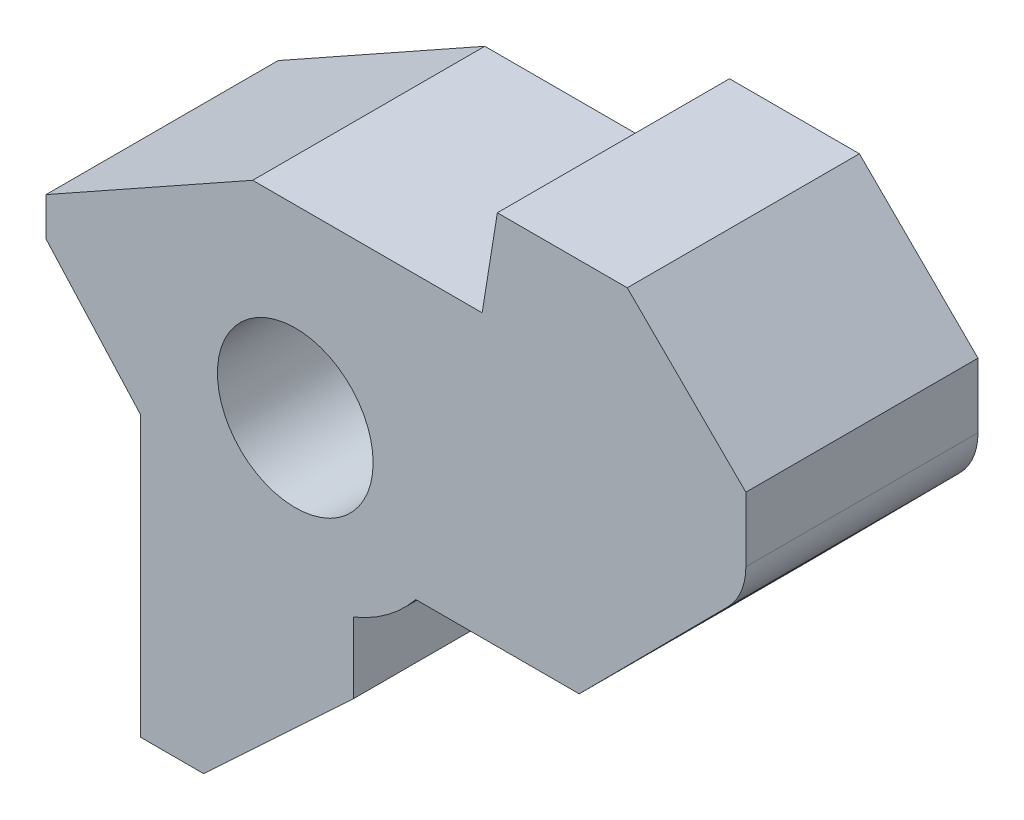
ISO-10303-21;
HEADER;
FILE_DESCRIPTION(('STEP AP214'),'2;1');
FILE_NAME('part.step','',(''),(''),'','','');
FILE_SCHEMA(('AUTOMOTIVE_DESIGN { 1 0 10303 214 1 1 1 1 }'));
ENDSEC;
DATA;
#1=APPLICATION_CONTEXT('core data for automotive mechanical design processes');
#2=APPLICATION_PROTOCOL_DEFINITION('international standard','automotive_design',2000,#1);
#3=PRODUCT_CONTEXT('',#1,'mechanical');
#4=PRODUCT('Part','Part','',(#3));
#5=PRODUCT_RELATED_PRODUCT_CATEGORY('part','',(#4));
#6=PRODUCT_DEFINITION_FORMATION('','',#4);
#7=PRODUCT_DEFINITION_CONTEXT('part definition',#1,'design');
#8=PRODUCT_DEFINITION('design','',#6,#7);
#9=PRODUCT_DEFINITION_SHAPE('','',#8);
#10=(LENGTH_UNIT() NAMED_UNIT(*) SI_UNIT(.MILLI.,.METRE.));
#11=(NAMED_UNIT(*) PLANE_ANGLE_UNIT() SI_UNIT($,.RADIAN.));
#12=(NAMED_UNIT(*) SI_UNIT($,.STERADIAN.) SOLID_ANGLE_UNIT());
#13=UNCERTAINTY_MEASURE_WITH_UNIT(LENGTH_MEASURE(1.E-05),#10,'distance_accuracy_value','');
#14=(GEOMETRIC_REPRESENTATION_CONTEXT(3) GLOBAL_UNCERTAINTY_ASSIGNED_CONTEXT((#13)) GLOBAL_UNIT_ASSIGNED_CONTEXT((#10,
#11,#12)) REPRESENTATION_CONTEXT('',''));
#15=CARTESIAN_POINT('',(0.,0.,0.));
#16=DIRECTION('',(0.,0.,1.));
#17=DIRECTION('',(1.,0.,0.));
#18=AXIS2_PLACEMENT_3D('',#15,#16,#17);
#19=CARTESIAN_POINT('',(1.87605445969652,0.,7.5));
#20=DIRECTION('',(1.,0.,0.));
#21=DIRECTION('',(0.,1.,0.));
#22=AXIS2_PLACEMENT_3D('',#19,#20,#21);
#23=PLANE('',#22);
#24=DIRECTION('',(0.,-1.,0.));
#25=VECTOR('',#24,1.);
#26=CARTESIAN_POINT('',(1.87605445969652,0.,0.));
#27=LINE('',#26,#25);
#28=CARTESIAN_POINT('',(1.87605445969652,-4.63469736490451,0.));
#29=VERTEX_POINT('',#28);
#30=CARTESIAN_POINT('',(1.87605445969652,-6.92386785714255,0.));
#31=VERTEX_POINT('',#30);
#32=EDGE_CURVE('E151',#29,#31,#27,.T.);
#33=ORIENTED_EDGE('',*,*,#32,.F.);
#34=DIRECTION('',(0.,0.,-1.));
#35=VECTOR('',#34,1.);
#36=CARTESIAN_POINT('',(1.87605445969652,-4.63469736490451,7.5));
#37=LINE('',#36,#35);
#38=CARTESIAN_POINT('',(1.87605445969652,-4.63469736490451,7.5));
#39=VERTEX_POINT('',#38);
#40=EDGE_CURVE('E146',#39,#29,#37,.T.);
#41=ORIENTED_EDGE('',*,*,#40,.F.);
#42=DIRECTION('',(0.,-1.,0.));
#43=VECTOR('',#42,1.);
#44=CARTESIAN_POINT('',(1.87605445969652,0.,7.5));
#45=LINE('',#44,#43);
#46=CARTESIAN_POINT('',(1.87605445969652,-6.92386785714255,7.5));
#47=VERTEX_POINT('',#46);
#48=EDGE_CURVE('E149',#39,#47,#45,.T.);
#49=ORIENTED_EDGE('',*,*,#48,.T.);
#50=DIRECTION('',(0.,0.,-1.));
#51=VECTOR('',#50,1.);
#52=CARTESIAN_POINT('',(1.87605445969652,-6.92386785714255,7.5));
#53=LINE('',#52,#51);
#54=EDGE_CURVE('E214',#47,#31,#53,.T.);
#55=ORIENTED_EDGE('',*,*,#54,.T.);
#56=EDGE_LOOP('',(#33,#41,#49,#55));
#57=FACE_BOUND('',#56,.T.);
#58=ADVANCED_FACE('F35',(#57),#23,.T.);
#59=CARTESIAN_POINT('',(0.,0.,7.5));
#60=DIRECTION('',(0.,0.,-1.));
#61=DIRECTION('',(-1.,0.,0.));
#62=AXIS2_PLACEMENT_3D('',#59,#60,#61);
#63=CYLINDRICAL_SURFACE('',#62,5.);
#64=CARTESIAN_POINT('',(0.,0.,0.));
#65=DIRECTION('',(0.,0.,1.));
#66=DIRECTION('',(1.,0.,0.));
#67=AXIS2_PLACEMENT_3D('',#64,#65,#66);
#68=CIRCLE('',#67,5.);
#69=CARTESIAN_POINT('',(3.8931956076666,-3.13736003041498,0.));
#70=VERTEX_POINT('',#69);
#71=EDGE_CURVE('E216',#29,#70,#68,.T.);
#72=ORIENTED_EDGE('',*,*,#71,.T.);
#73=DIRECTION('',(0.,0.,-1.));
#74=VECTOR('',#73,1.);
#75=CARTESIAN_POINT('',(3.8931956076666,-3.13736003041498,7.5));
#76=LINE('',#75,#74);
#77=CARTESIAN_POINT('',(3.8931956076666,-3.13736003041498,7.5));
#78=VERTEX_POINT('',#77);
#79=EDGE_CURVE('E156',#78,#70,#76,.T.);
#80=ORIENTED_EDGE('',*,*,#79,.F.);
#81=CARTESIAN_POINT('',(0.,0.,7.5));
#82=DIRECTION('',(0.,0.,1.));
#83=DIRECTION('',(1.,0.,0.));
#84=AXIS2_PLACEMENT_3D('',#81,#82,#83);
#85=CIRCLE('',#84,5.);
#86=EDGE_CURVE('E159',#39,#78,#85,.T.);
#87=ORIENTED_EDGE('',*,*,#86,.F.);
#88=ORIENTED_EDGE('',*,*,#40,.T.);
#89=EDGE_LOOP('',(#72,#80,#87,#88));
#90=FACE_BOUND('',#89,.T.);
#91=ADVANCED_FACE('F160',(#90),#63,.T.);
#92=CARTESIAN_POINT('',(0.,-3.13736003041498,7.5));
#93=DIRECTION('',(0.,-1.,0.));
#94=DIRECTION('',(1.,0.,0.));
#95=AXIS2_PLACEMENT_3D('',#92,#93,#94);
#96=PLANE('',#95);
#97=DIRECTION('',(-1.,0.,0.));
#98=VECTOR('',#97,1.);
#99=CARTESIAN_POINT('',(0.,-3.13736003041498,0.));
#100=LINE('',#99,#98);
#101=CARTESIAN_POINT('',(9.17297865889068,-3.13736003041498,0.));
#102=VERTEX_POINT('',#101);
#103=EDGE_CURVE('E218',#102,#70,#100,.T.);
#104=ORIENTED_EDGE('',*,*,#103,.F.);
#105=DIRECTION('',(0.,0.,-1.));
#106=VECTOR('',#105,1.);
#107=CARTESIAN_POINT('',(9.17297865889068,-3.13736003041498,7.5));
#108=LINE('',#107,#106);
#109=CARTESIAN_POINT('',(9.17297865889068,-3.13736003041498,7.5));
#110=VERTEX_POINT('',#109);
#111=EDGE_CURVE('E275',#110,#102,#108,.T.);
#112=ORIENTED_EDGE('',*,*,#111,.F.);
#113=DIRECTION('',(-1.,0.,0.));
#114=VECTOR('',#113,1.);
#115=CARTESIAN_POINT('',(0.,-3.13736003041498,7.5));
#116=LINE('',#115,#114);
#117=EDGE_CURVE('E164',#110,#78,#116,.T.);
#118=ORIENTED_EDGE('',*,*,#117,.T.);
#119=ORIENTED_EDGE('',*,*,#79,.T.);
#120=EDGE_LOOP('',(#104,#112,#118,#119));
#121=FACE_BOUND('',#120,.T.);
#122=ADVANCED_FACE('F305',(#121),#96,.T.);
#123=CARTESIAN_POINT('',(6.18871742745594,-6.14355777107952,7.5));
#124=DIRECTION('',(0.709691382805682,-0.704512697665102,0.));
#125=DIRECTION('',(0.704512697665102,0.709691382805682,0.));
#126=AXIS2_PLACEMENT_3D('',#123,#124,#125);
#127=PLANE('',#126);
#128=DIRECTION('',(-0.704512697665102,-0.709691382805682,0.));
#129=VECTOR('',#128,1.);
#130=CARTESIAN_POINT('',(6.18871742745594,-6.14355777107952,0.));
#131=LINE('',#130,#129);
#132=CARTESIAN_POINT('',(13.9764570076674,1.70142740793573,0.));
#133=VERTEX_POINT('',#132);
#134=EDGE_CURVE('E221',#133,#102,#131,.T.);
#135=ORIENTED_EDGE('',*,*,#134,.F.);
#136=DIRECTION('',(0.,0.,-1.));
#137=VECTOR('',#136,1.);
#138=CARTESIAN_POINT('',(13.9764570076674,1.70142740793573,7.5));
#139=LINE('',#138,#137);
#140=CARTESIAN_POINT('',(13.9764570076674,1.70142740793573,7.5));
#141=VERTEX_POINT('',#140);
#142=EDGE_CURVE('E43',#133,#141,#139,.F.);
#143=ORIENTED_EDGE('',*,*,#142,.T.);
#144=DIRECTION('',(-0.704512697665102,-0.709691382805682,0.));
#145=VECTOR('',#144,1.);
#146=CARTESIAN_POINT('',(6.18871742745594,-6.14355777107952,7.5));
#147=LINE('',#146,#145);
#148=EDGE_CURVE('E179',#141,#110,#147,.T.);
#149=ORIENTED_EDGE('',*,*,#148,.T.);
#150=ORIENTED_EDGE('',*,*,#111,.T.);
#151=EDGE_LOOP('',(#135,#143,#149,#150));
#152=FACE_BOUND('',#151,.T.);
#153=ADVANCED_FACE('F310',(#152),#127,.T.);
#154=CARTESIAN_POINT('',(14.557074242056,0.,7.5));
#155=DIRECTION('',(1.,0.,0.));
#156=DIRECTION('',(0.,0.,-1.));
#157=AXIS2_PLACEMENT_3D('',#154,#155,#156);
#158=PLANE('',#157);
#159=DIRECTION('',(0.,-1.,0.));
#160=VECTOR('',#159,1.);
#161=CARTESIAN_POINT('',(14.557074242056,0.,7.5));
#162=LINE('',#161,#160);
#163=CARTESIAN_POINT('',(14.557074242056,5.19802237614641,7.5));
#164=VERTEX_POINT('',#163);
#165=CARTESIAN_POINT('',(14.557074242056,3.11045280326593,7.5));
#166=VERTEX_POINT('',#165);
#167=EDGE_CURVE('E181',#164,#166,#162,.T.);
#168=ORIENTED_EDGE('',*,*,#167,.T.);
#169=DIRECTION('',(0.,0.,-1.));
#170=VECTOR('',#169,1.);
#171=CARTESIAN_POINT('',(14.557074242056,3.11045280326593,7.5));
#172=LINE('',#171,#170);
#173=CARTESIAN_POINT('',(14.557074242056,3.11045280326593,0.));
#174=VERTEX_POINT('',#173);
#175=EDGE_CURVE('E155',#166,#174,#172,.T.);
#176=ORIENTED_EDGE('',*,*,#175,.T.);
#177=DIRECTION('',(0.,-1.,0.));
#178=VECTOR('',#177,1.);
#179=CARTESIAN_POINT('',(14.557074242056,0.,0.));
#180=LINE('',#179,#178);
#181=CARTESIAN_POINT('',(14.557074242056,5.19802237614641,0.));
#182=VERTEX_POINT('',#181);
#183=EDGE_CURVE('E223',#182,#174,#180,.T.);
#184=ORIENTED_EDGE('',*,*,#183,.F.);
#185=DIRECTION('',(0.,0.,-1.));
#186=VECTOR('',#185,1.);
#187=CARTESIAN_POINT('',(14.557074242056,5.19802237614641,7.5));
#188=LINE('',#187,#186);
#189=EDGE_CURVE('E273',#164,#182,#188,.T.);
#190=ORIENTED_EDGE('',*,*,#189,.F.);
#191=EDGE_LOOP('',(#168,#176,#184,#190));
#192=FACE_BOUND('',#191,.T.);
#193=ADVANCED_FACE('F284',(#192),#158,.T.);
#194=CARTESIAN_POINT('',(9.82417265596004,9.89638753174656,7.5));
#195=DIRECTION('',(0.704512697665102,0.709691382805682,0.));
#196=DIRECTION('',(-0.709691382805682,0.704512697665102,0.));
#197=AXIS2_PLACEMENT_3D('',#194,#195,#196);
#198=PLANE('',#197);
#199=DIRECTION('',(0.709691382805682,-0.704512697665102,0.));
#200=VECTOR('',#199,1.);
#201=CARTESIAN_POINT('',(9.82417265596004,9.89638753174656,0.));
#202=LINE('',#201,#200);
#203=CARTESIAN_POINT('',(10.7256498043451,9.00148854737192,0.));
#204=VERTEX_POINT('',#203);
#205=EDGE_CURVE('E225',#204,#182,#202,.T.);
#206=ORIENTED_EDGE('',*,*,#205,.F.);
#207=DIRECTION('',(0.,0.,-1.));
#208=VECTOR('',#207,1.);
#209=CARTESIAN_POINT('',(10.7256498043451,9.00148854737192,7.5));
#210=LINE('',#209,#208);
#211=CARTESIAN_POINT('',(10.7256498043451,9.00148854737192,7.5));
#212=VERTEX_POINT('',#211);
#213=EDGE_CURVE('E271',#212,#204,#210,.T.);
#214=ORIENTED_EDGE('',*,*,#213,.F.);
#215=DIRECTION('',(0.709691382805682,-0.704512697665102,0.));
#216=VECTOR('',#215,1.);
#217=CARTESIAN_POINT('',(9.82417265596004,9.89638753174656,7.5));
#218=LINE('',#217,#216);
#219=EDGE_CURVE('E184',#212,#164,#218,.T.);
#220=ORIENTED_EDGE('',*,*,#219,.T.);
#221=ORIENTED_EDGE('',*,*,#189,.T.);
#222=EDGE_LOOP('',(#206,#214,#220,#221));
#223=FACE_BOUND('',#222,.T.);
#224=ADVANCED_FACE('F293',(#223),#198,.T.);
#225=CARTESIAN_POINT('',(0.,9.00148854737192,7.5));
#226=DIRECTION('',(0.,1.,0.));
#227=DIRECTION('',(0.,0.,1.));
#228=AXIS2_PLACEMENT_3D('',#225,#226,#227);
#229=PLANE('',#228);
#230=DIRECTION('',(1.,0.,0.));
#231=VECTOR('',#230,1.);
#232=CARTESIAN_POINT('',(0.,9.00148854737192,0.));
#233=LINE('',#232,#231);
#234=CARTESIAN_POINT('',(6.5285930170798,9.00148854737192,0.));
#235=VERTEX_POINT('',#234);
#236=EDGE_CURVE('E228',#235,#204,#233,.T.);
#237=ORIENTED_EDGE('',*,*,#236,.F.);
#238=DIRECTION('',(0.,0.,-1.));
#239=VECTOR('',#238,1.);
#240=CARTESIAN_POINT('',(6.5285930170798,9.00148854737192,7.5));
#241=LINE('',#240,#239);
#242=CARTESIAN_POINT('',(6.5285930170798,9.00148854737192,7.5));
#243=VERTEX_POINT('',#242);
#244=EDGE_CURVE('E269',#243,#235,#241,.T.);
#245=ORIENTED_EDGE('',*,*,#244,.F.);
#246=DIRECTION('',(1.,0.,0.));
#247=VECTOR('',#246,1.);
#248=CARTESIAN_POINT('',(0.,9.00148854737192,7.5));
#249=LINE('',#248,#247);
#250=EDGE_CURVE('E187',#243,#212,#249,.T.);
#251=ORIENTED_EDGE('',*,*,#250,.T.);
#252=ORIENTED_EDGE('',*,*,#213,.T.);
#253=EDGE_LOOP('',(#237,#245,#251,#252));
#254=FACE_BOUND('',#253,.T.);
#255=ADVANCED_FACE('F318',(#254),#229,.T.);
#256=CARTESIAN_POINT('',(4.94893615583577,-0.797776271857066,7.5));
#257=DIRECTION('',(-0.987254891374429,0.159147037224273,0.));
#258=DIRECTION('',(-0.159147037224273,-0.987254891374429,0.));
#259=AXIS2_PLACEMENT_3D('',#256,#257,#258);
#260=PLANE('',#259);
#261=DIRECTION('',(0.159147037224273,0.987254891374429,0.));
#262=VECTOR('',#261,1.);
#263=CARTESIAN_POINT('',(4.94893615583577,-0.797776271857066,0.));
#264=LINE('',#263,#262);
#265=CARTESIAN_POINT('',(6.03788217845628,5.95740626892641,0.));
#266=VERTEX_POINT('',#265);
#267=EDGE_CURVE('E231',#266,#235,#264,.T.);
#268=ORIENTED_EDGE('',*,*,#267,.F.);
#269=DIRECTION('',(0.,0.,-1.));
#270=VECTOR('',#269,1.);
#271=CARTESIAN_POINT('',(6.03788217845628,5.95740626892641,7.5));
#272=LINE('',#271,#270);
#273=CARTESIAN_POINT('',(6.03788217845628,5.95740626892641,7.5));
#274=VERTEX_POINT('',#273);
#275=EDGE_CURVE('E267',#274,#266,#272,.T.);
#276=ORIENTED_EDGE('',*,*,#275,.F.);
#277=DIRECTION('',(0.159147037224273,0.987254891374429,0.));
#278=VECTOR('',#277,1.);
#279=CARTESIAN_POINT('',(4.94893615583577,-0.797776271857066,7.5));
#280=LINE('',#279,#278);
#281=EDGE_CURVE('E190',#274,#243,#280,.T.);
#282=ORIENTED_EDGE('',*,*,#281,.T.);
#283=ORIENTED_EDGE('',*,*,#244,.T.);
#284=EDGE_LOOP('',(#268,#276,#282,#283));
#285=FACE_BOUND('',#284,.T.);
#286=ADVANCED_FACE('F321',(#285),#260,.T.);
#287=CARTESIAN_POINT('',(0.,5.95740626892641,7.5));
#288=DIRECTION('',(0.,-1.,0.));
#289=DIRECTION('',(1.,0.,0.));
#290=AXIS2_PLACEMENT_3D('',#287,#288,#289);
#291=PLANE('',#290);
#292=DIRECTION('',(-1.,0.,0.));
#293=VECTOR('',#292,1.);
#294=CARTESIAN_POINT('',(0.,5.95740626892641,0.));
#295=LINE('',#294,#293);
#296=CARTESIAN_POINT('',(-1.37635566788677,5.95740626892641,0.));
#297=VERTEX_POINT('',#296);
#298=EDGE_CURVE('E234',#266,#297,#295,.T.);
#299=ORIENTED_EDGE('',*,*,#298,.T.);
#300=DIRECTION('',(0.,0.,-1.));
#301=VECTOR('',#300,1.);
#302=CARTESIAN_POINT('',(-1.37635566788677,5.95740626892641,7.5));
#303=LINE('',#302,#301);
#304=CARTESIAN_POINT('',(-1.37635566788677,5.95740626892641,7.5));
#305=VERTEX_POINT('',#304);
#306=EDGE_CURVE('E265',#305,#297,#303,.T.);
#307=ORIENTED_EDGE('',*,*,#306,.F.);
#308=DIRECTION('',(-1.,0.,0.));
#309=VECTOR('',#308,1.);
#310=CARTESIAN_POINT('',(0.,5.95740626892641,7.5));
#311=LINE('',#310,#309);
#312=EDGE_CURVE('E193',#274,#305,#311,.T.);
#313=ORIENTED_EDGE('',*,*,#312,.F.);
#314=ORIENTED_EDGE('',*,*,#275,.T.);
#315=EDGE_LOOP('',(#299,#307,#313,#314));
#316=FACE_BOUND('',#315,.T.);
#317=ADVANCED_FACE('F325',(#316),#291,.F.);
#318=CARTESIAN_POINT('',(-2.8678772487103,5.12233826098467,7.5));
#319=DIRECTION('',(-0.488521388480712,0.872551919943379,0.));
#320=DIRECTION('',(-0.872551919943379,-0.488521388480712,0.));
#321=AXIS2_PLACEMENT_3D('',#318,#319,#320);
#322=PLANE('',#321);
#323=DIRECTION('',(0.872551919943379,0.488521388480713,0.));
#324=VECTOR('',#323,1.);
#325=CARTESIAN_POINT('',(-2.8678772487103,5.12233826098467,0.));
#326=LINE('',#325,#324);
#327=CARTESIAN_POINT('',(-8.05314300071572,2.21922938354898,0.));
#328=VERTEX_POINT('',#327);
#329=EDGE_CURVE('E237',#328,#297,#326,.T.);
#330=ORIENTED_EDGE('',*,*,#329,.F.);
#331=DIRECTION('',(0.,0.,-1.));
#332=VECTOR('',#331,1.);
#333=CARTESIAN_POINT('',(-8.05314300071572,2.21922938354898,7.5));
#334=LINE('',#333,#332);
#335=CARTESIAN_POINT('',(-8.05314300071572,2.21922938354898,7.5));
#336=VERTEX_POINT('',#335);
#337=EDGE_CURVE('E263',#336,#328,#334,.T.);
#338=ORIENTED_EDGE('',*,*,#337,.F.);
#339=DIRECTION('',(0.872551919943379,0.488521388480713,0.));
#340=VECTOR('',#339,1.);
#341=CARTESIAN_POINT('',(-2.8678772487103,5.12233826098467,7.5));
#342=LINE('',#341,#340);
#343=EDGE_CURVE('E195',#336,#305,#342,.T.);
#344=ORIENTED_EDGE('',*,*,#343,.T.);
#345=ORIENTED_EDGE('',*,*,#306,.T.);
#346=EDGE_LOOP('',(#330,#338,#344,#345));
#347=FACE_BOUND('',#346,.T.);
#348=ADVANCED_FACE('F329',(#347),#322,.T.);
#349=CARTESIAN_POINT('',(-8.05314300071572,0.,7.5));
#350=DIRECTION('',(-1.,0.,0.));
#351=DIRECTION('',(0.,0.,1.));
#352=AXIS2_PLACEMENT_3D('',#349,#350,#351);
#353=PLANE('',#352);
#354=DIRECTION('',(0.,1.,0.));
#355=VECTOR('',#354,1.);
#356=CARTESIAN_POINT('',(-8.05314300071572,0.,0.));
#357=LINE('',#356,#355);
#358=CARTESIAN_POINT('',(-8.05314300071572,0.978578294747309,0.));
#359=VERTEX_POINT('',#358);
#360=EDGE_CURVE('E240',#359,#328,#357,.T.);
#361=ORIENTED_EDGE('',*,*,#360,.F.);
#362=DIRECTION('',(0.,0.,-1.));
#363=VECTOR('',#362,1.);
#364=CARTESIAN_POINT('',(-8.05314300071572,0.978578294747309,7.5));
#365=LINE('',#364,#363);
#366=CARTESIAN_POINT('',(-8.05314300071572,0.978578294747309,7.5));
#367=VERTEX_POINT('',#366);
#368=EDGE_CURVE('E261',#367,#359,#365,.T.);
#369=ORIENTED_EDGE('',*,*,#368,.F.);
#370=DIRECTION('',(0.,1.,0.));
#371=VECTOR('',#370,1.);
#372=CARTESIAN_POINT('',(-8.05314300071572,0.,7.5));
#373=LINE('',#372,#371);
#374=EDGE_CURVE('E198',#367,#336,#373,.T.);
#375=ORIENTED_EDGE('',*,*,#374,.T.);
#376=ORIENTED_EDGE('',*,*,#337,.T.);
#377=EDGE_LOOP('',(#361,#369,#375,#376));
#378=FACE_BOUND('',#377,.T.);
#379=ADVANCED_FACE('F333',(#378),#353,.T.);
#380=CARTESIAN_POINT('',(-3.95697377108317,-3.5663042831013,7.5));
#381=DIRECTION('',(-0.742824639331619,-0.66948603809329,0.));
#382=DIRECTION('',(0.66948603809329,-0.742824639331619,0.));
#383=AXIS2_PLACEMENT_3D('',#380,#381,#382);
#384=PLANE('',#383);
#385=DIRECTION('',(-0.66948603809329,0.742824639331619,0.));
#386=VECTOR('',#385,1.);
#387=CARTESIAN_POINT('',(-3.95697377108317,-3.5663042831013,0.));
#388=LINE('',#387,#386);
#389=CARTESIAN_POINT('',(-5.,-2.40902013044717,0.));
#390=VERTEX_POINT('',#389);
#391=EDGE_CURVE('E243',#390,#359,#388,.T.);
#392=ORIENTED_EDGE('',*,*,#391,.F.);
#393=DIRECTION('',(0.,0.,-1.));
#394=VECTOR('',#393,1.);
#395=CARTESIAN_POINT('',(-5.,-2.40902013044717,7.5));
#396=LINE('',#395,#394);
#397=CARTESIAN_POINT('',(-5.,-2.40902013044717,7.5));
#398=VERTEX_POINT('',#397);
#399=EDGE_CURVE('E259',#398,#390,#396,.T.);
#400=ORIENTED_EDGE('',*,*,#399,.F.);
#401=DIRECTION('',(-0.66948603809329,0.742824639331619,0.));
#402=VECTOR('',#401,1.);
#403=CARTESIAN_POINT('',(-3.95697377108317,-3.5663042831013,7.5));
#404=LINE('',#403,#402);
#405=EDGE_CURVE('E201',#398,#367,#404,.T.);
#406=ORIENTED_EDGE('',*,*,#405,.T.);
#407=ORIENTED_EDGE('',*,*,#368,.T.);
#408=EDGE_LOOP('',(#392,#400,#406,#407));
#409=FACE_BOUND('',#408,.T.);
#410=ADVANCED_FACE('F337',(#409),#384,.T.);
#411=CARTESIAN_POINT('',(-5.,0.,7.5));
#412=DIRECTION('',(-1.,0.,0.));
#413=DIRECTION('',(0.,0.,1.));
#414=AXIS2_PLACEMENT_3D('',#411,#412,#413);
#415=PLANE('',#414);
#416=DIRECTION('',(0.,1.,0.));
#417=VECTOR('',#416,1.);
#418=CARTESIAN_POINT('',(-5.,0.,0.));
#419=LINE('',#418,#417);
#420=CARTESIAN_POINT('',(-5.,-11.436332263735,0.));
#421=VERTEX_POINT('',#420);
#422=EDGE_CURVE('E246',#421,#390,#419,.T.);
#423=ORIENTED_EDGE('',*,*,#422,.F.);
#424=DIRECTION('',(0.,0.,-1.));
#425=VECTOR('',#424,1.);
#426=CARTESIAN_POINT('',(-5.,-11.436332263735,7.5));
#427=LINE('',#426,#425);
#428=CARTESIAN_POINT('',(-5.,-11.436332263735,7.5));
#429=VERTEX_POINT('',#428);
#430=EDGE_CURVE('E257',#429,#421,#427,.T.);
#431=ORIENTED_EDGE('',*,*,#430,.F.);
#432=DIRECTION('',(0.,1.,0.));
#433=VECTOR('',#432,1.);
#434=CARTESIAN_POINT('',(-5.,0.,7.5));
#435=LINE('',#434,#433);
#436=EDGE_CURVE('E204',#429,#398,#435,.T.);
#437=ORIENTED_EDGE('',*,*,#436,.T.);
#438=ORIENTED_EDGE('',*,*,#399,.T.);
#439=EDGE_LOOP('',(#423,#431,#437,#438));
#440=FACE_BOUND('',#439,.T.);
#441=ADVANCED_FACE('F341',(#440),#415,.T.);
#442=CARTESIAN_POINT('',(0.,-11.436332263735,7.5));
#443=DIRECTION('',(0.,-1.,0.));
#444=DIRECTION('',(0.,0.,-1.));
#445=AXIS2_PLACEMENT_3D('',#442,#443,#444);
#446=PLANE('',#445);
#447=DIRECTION('',(-1.,0.,0.));
#448=VECTOR('',#447,1.);
#449=CARTESIAN_POINT('',(0.,-11.436332263735,0.));
#450=LINE('',#449,#448);
#451=CARTESIAN_POINT('',(-2.95681906505285,-11.436332263735,0.));
#452=VERTEX_POINT('',#451);
#453=EDGE_CURVE('E249',#452,#421,#450,.T.);
#454=ORIENTED_EDGE('',*,*,#453,.F.);
#455=DIRECTION('',(0.,0.,-1.));
#456=VECTOR('',#455,1.);
#457=CARTESIAN_POINT('',(-2.95681906505285,-11.436332263735,7.5));
#458=LINE('',#457,#456);
#459=CARTESIAN_POINT('',(-2.95681906505285,-11.436332263735,7.5));
#460=VERTEX_POINT('',#459);
#461=EDGE_CURVE('E255',#460,#452,#458,.T.);
#462=ORIENTED_EDGE('',*,*,#461,.F.);
#463=DIRECTION('',(-1.,0.,0.));
#464=VECTOR('',#463,1.);
#465=CARTESIAN_POINT('',(0.,-11.436332263735,7.5));
#466=LINE('',#465,#464);
#467=EDGE_CURVE('E207',#460,#429,#466,.T.);
#468=ORIENTED_EDGE('',*,*,#467,.T.);
#469=ORIENTED_EDGE('',*,*,#430,.T.);
#470=EDGE_LOOP('',(#454,#462,#468,#469));
#471=FACE_BOUND('',#470,.T.);
#472=ADVANCED_FACE('F345',(#471),#446,.T.);
#473=CARTESIAN_POINT('',(4.3275859112869,-4.63486766702953,7.5));
#474=DIRECTION('',(-0.682462310143159,0.730920785881796,0.));
#475=DIRECTION('',(-0.730920785881796,-0.682462310143159,0.));
#476=AXIS2_PLACEMENT_3D('',#473,#474,#475);
#477=PLANE('',#476);
#478=DIRECTION('',(0.730920785881796,0.682462310143159,0.));
#479=VECTOR('',#478,1.);
#480=CARTESIAN_POINT('',(4.3275859112869,-4.63486766702953,0.));
#481=LINE('',#480,#479);
#482=EDGE_CURVE('E175',#452,#31,#481,.T.);
#483=ORIENTED_EDGE('',*,*,#482,.T.);
#484=ORIENTED_EDGE('',*,*,#54,.F.);
#485=DIRECTION('',(0.730920785881796,0.682462310143159,0.));
#486=VECTOR('',#485,1.);
#487=CARTESIAN_POINT('',(4.3275859112869,-4.63486766702953,7.5));
#488=LINE('',#487,#486);
#489=EDGE_CURVE('E170',#460,#47,#488,.T.);
#490=ORIENTED_EDGE('',*,*,#489,.F.);
#491=ORIENTED_EDGE('',*,*,#461,.T.);
#492=EDGE_LOOP('',(#483,#484,#490,#491));
#493=FACE_BOUND('',#492,.T.);
#494=ADVANCED_FACE('F349',(#493),#477,.F.);
#495=CARTESIAN_POINT('',(0.,0.,7.5));
#496=DIRECTION('',(0.,0.,-1.));
#497=DIRECTION('',(-1.,0.,0.));
#498=AXIS2_PLACEMENT_3D('',#495,#496,#497);
#499=CYLINDRICAL_SURFACE('',#498,2.515);
#500=CARTESIAN_POINT('',(0.,0.,7.5));
#501=DIRECTION('',(0.,0.,1.));
#502=DIRECTION('',(1.,0.,0.));
#503=AXIS2_PLACEMENT_3D('',#500,#501,#502);
#504=CIRCLE('',#503,2.515);
#505=CARTESIAN_POINT('',(2.515,0.,7.5));
#506=VERTEX_POINT('',#505);
#507=EDGE_CURVE('E211',#506,#506,#504,.T.);
#508=ORIENTED_EDGE('',*,*,#507,.T.);
#509=EDGE_LOOP('',(#508));
#510=FACE_BOUND('',#509,.T.);
#511=CARTESIAN_POINT('',(0.,0.,0.));
#512=DIRECTION('',(0.,0.,1.));
#513=DIRECTION('',(1.,0.,0.));
#514=AXIS2_PLACEMENT_3D('',#511,#512,#513);
#515=CIRCLE('',#514,2.515);
#516=CARTESIAN_POINT('',(2.515,0.,0.));
#517=VERTEX_POINT('',#516);
#518=EDGE_CURVE('E172',#517,#517,#515,.T.);
#519=ORIENTED_EDGE('',*,*,#518,.F.);
#520=EDGE_LOOP('',(#519));
#521=FACE_BOUND('',#520,.T.);
#522=ADVANCED_FACE('F353',(#510,#521),#499,.F.);
#523=CARTESIAN_POINT('',(0.,0.,7.5));
#524=DIRECTION('',(0.,0.,1.));
#525=DIRECTION('',(1.,0.,0.));
#526=AXIS2_PLACEMENT_3D('',#523,#524,#525);
#527=PLANE('',#526);
#528=ORIENTED_EDGE('',*,*,#148,.F.);
#529=CARTESIAN_POINT('',(12.557074242056,3.11045280326593,7.5));
#530=DIRECTION('',(0.,0.,1.));
#531=DIRECTION('',(1.,0.,0.));
#532=AXIS2_PLACEMENT_3D('',#529,#530,#531);
#533=CIRCLE('',#532,2.);
#534=EDGE_CURVE('E11',#141,#166,#533,.T.);
#535=ORIENTED_EDGE('',*,*,#534,.T.);
#536=ORIENTED_EDGE('',*,*,#167,.F.);
#537=ORIENTED_EDGE('',*,*,#219,.F.);
#538=ORIENTED_EDGE('',*,*,#250,.F.);
#539=ORIENTED_EDGE('',*,*,#281,.F.);
#540=ORIENTED_EDGE('',*,*,#312,.T.);
#541=ORIENTED_EDGE('',*,*,#343,.F.);
#542=ORIENTED_EDGE('',*,*,#374,.F.);
#543=ORIENTED_EDGE('',*,*,#405,.F.);
#544=ORIENTED_EDGE('',*,*,#436,.F.);
#545=ORIENTED_EDGE('',*,*,#467,.F.);
#546=ORIENTED_EDGE('',*,*,#489,.T.);
#547=ORIENTED_EDGE('',*,*,#48,.F.);
#548=ORIENTED_EDGE('',*,*,#86,.T.);
#549=ORIENTED_EDGE('',*,*,#117,.F.);
#550=EDGE_LOOP('',(#528,#535,#536,#537,#538,#539,#540,#541,#542,#543,#544,#545,#546,#547,#548,#549));
#551=FACE_BOUND('',#550,.T.);
#552=ORIENTED_EDGE('',*,*,#507,.F.);
#553=EDGE_LOOP('',(#552));
#554=FACE_BOUND('',#553,.T.);
#555=ADVANCED_FACE('F166',(#551,#554),#527,.T.);
#556=CARTESIAN_POINT('',(0.,0.,0.));
#557=DIRECTION('',(0.,0.,1.));
#558=DIRECTION('',(1.,0.,0.));
#559=AXIS2_PLACEMENT_3D('',#556,#557,#558);
#560=PLANE('',#559);
#561=ORIENTED_EDGE('',*,*,#183,.T.);
#562=CARTESIAN_POINT('',(12.557074242056,3.11045280326593,0.));
#563=DIRECTION('',(0.,0.,1.));
#564=DIRECTION('',(1.,0.,0.));
#565=AXIS2_PLACEMENT_3D('',#562,#563,#564);
#566=CIRCLE('',#565,2.);
#567=EDGE_CURVE('E57',#174,#133,#566,.F.);
#568=ORIENTED_EDGE('',*,*,#567,.T.);
#569=ORIENTED_EDGE('',*,*,#134,.T.);
#570=ORIENTED_EDGE('',*,*,#103,.T.);
#571=ORIENTED_EDGE('',*,*,#71,.F.);
#572=ORIENTED_EDGE('',*,*,#32,.T.);
#573=ORIENTED_EDGE('',*,*,#482,.F.);
#574=ORIENTED_EDGE('',*,*,#453,.T.);
#575=ORIENTED_EDGE('',*,*,#422,.T.);
#576=ORIENTED_EDGE('',*,*,#391,.T.);
#577=ORIENTED_EDGE('',*,*,#360,.T.);
#578=ORIENTED_EDGE('',*,*,#329,.T.);
#579=ORIENTED_EDGE('',*,*,#298,.F.);
#580=ORIENTED_EDGE('',*,*,#267,.T.);
#581=ORIENTED_EDGE('',*,*,#236,.T.);
#582=ORIENTED_EDGE('',*,*,#205,.T.);
#583=EDGE_LOOP('',(#561,#568,#569,#570,#571,#572,#573,#574,#575,#576,#577,#578,#579,#580,#581,#582));
#584=FACE_BOUND('',#583,.T.);
#585=ORIENTED_EDGE('',*,*,#518,.T.);
#586=EDGE_LOOP('',(#585));
#587=FACE_BOUND('',#586,.T.);
#588=ADVANCED_FACE('F288',(#584,#587),#560,.F.);
#589=CARTESIAN_POINT('',(12.557074242056,3.11045280326593,7.5));
#590=DIRECTION('',(0.,0.,-1.));
#591=DIRECTION('',(-1.,0.,0.));
#592=AXIS2_PLACEMENT_3D('',#589,#590,#591);
#593=CYLINDRICAL_SURFACE('',#592,2.);
#594=ORIENTED_EDGE('',*,*,#534,.F.);
#595=ORIENTED_EDGE('',*,*,#142,.F.);
#596=ORIENTED_EDGE('',*,*,#567,.F.);
#597=ORIENTED_EDGE('',*,*,#175,.F.);
#598=EDGE_LOOP('',(#594,#595,#596,#597));
#599=FACE_BOUND('',#598,.T.);
#600=ADVANCED_FACE('F37',(#599),#593,.T.);
#601=CLOSED_SHELL('',(#58,#91,#122,#153,#193,#224,#255,#286,#317,#348,#379,#410,#441,#472,#494,
#522,#555,#588,#600));
#602=MANIFOLD_SOLID_BREP('B2',#601);
#603=ADVANCED_BREP_SHAPE_REPRESENTATION('',(#18,#602),#14);
#604=SHAPE_DEFINITION_REPRESENTATION(#9,#603);
ENDSEC;
END-ISO-10303-21;
